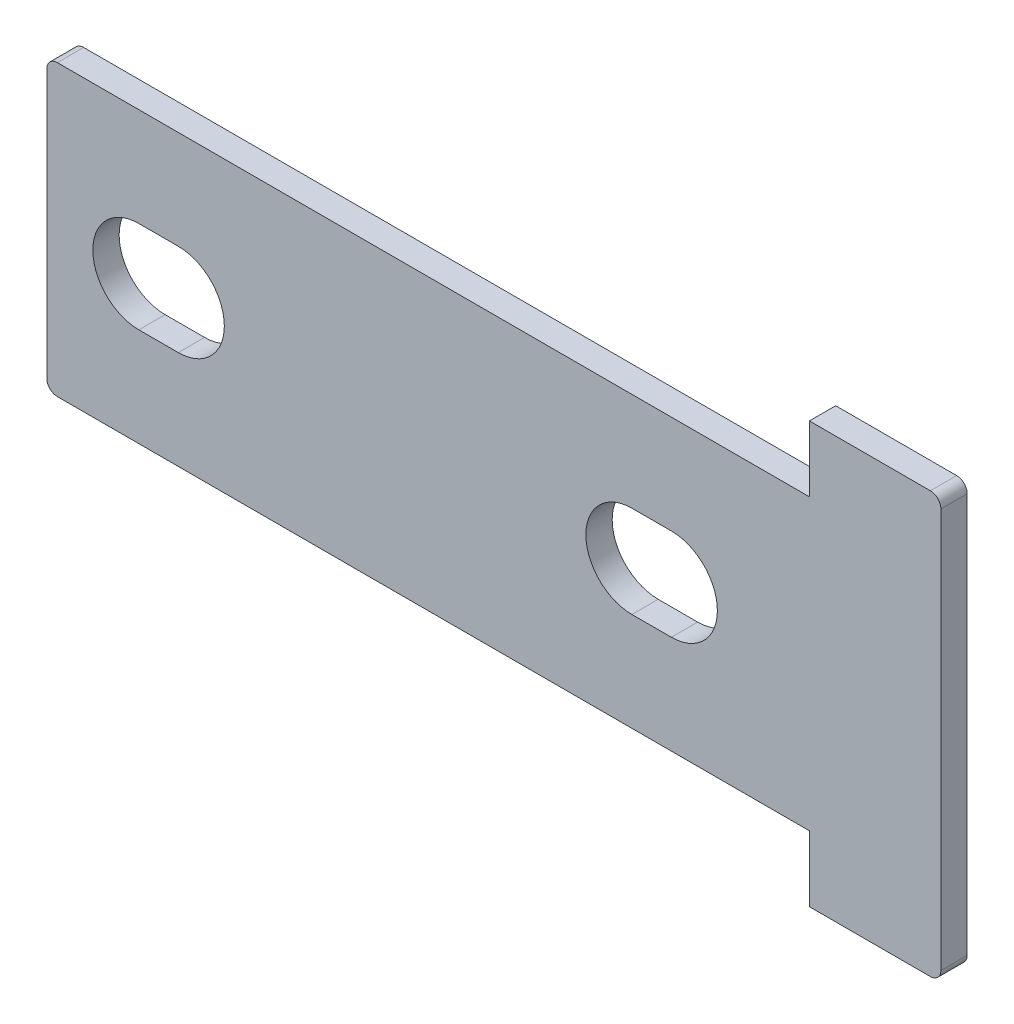
ISO-10303-21;
HEADER;
FILE_DESCRIPTION(('STEP AP214'),'2;1');
FILE_NAME('part.step','',(''),(''),'','','');
FILE_SCHEMA(('AUTOMOTIVE_DESIGN { 1 0 10303 214 1 1 1 1 }'));
ENDSEC;
DATA;
#1=APPLICATION_CONTEXT('core data for automotive mechanical design processes');
#2=APPLICATION_PROTOCOL_DEFINITION('international standard','automotive_design',2000,#1);
#3=PRODUCT_CONTEXT('',#1,'mechanical');
#4=PRODUCT('Part','Part','',(#3));
#5=PRODUCT_RELATED_PRODUCT_CATEGORY('part','',(#4));
#6=PRODUCT_DEFINITION_FORMATION('','',#4);
#7=PRODUCT_DEFINITION_CONTEXT('part definition',#1,'design');
#8=PRODUCT_DEFINITION('design','',#6,#7);
#9=PRODUCT_DEFINITION_SHAPE('','',#8);
#10=(LENGTH_UNIT() NAMED_UNIT(*) SI_UNIT(.MILLI.,.METRE.));
#11=(NAMED_UNIT(*) PLANE_ANGLE_UNIT() SI_UNIT($,.RADIAN.));
#12=(NAMED_UNIT(*) SI_UNIT($,.STERADIAN.) SOLID_ANGLE_UNIT());
#13=UNCERTAINTY_MEASURE_WITH_UNIT(LENGTH_MEASURE(1.E-05),#10,'distance_accuracy_value','');
#14=(GEOMETRIC_REPRESENTATION_CONTEXT(3) GLOBAL_UNCERTAINTY_ASSIGNED_CONTEXT((#13)) GLOBAL_UNIT_ASSIGNED_CONTEXT((#10,
#11,#12)) REPRESENTATION_CONTEXT('',''));
#15=CARTESIAN_POINT('',(0.,0.,0.));
#16=DIRECTION('',(0.,0.,1.));
#17=DIRECTION('',(1.,0.,0.));
#18=AXIS2_PLACEMENT_3D('',#15,#16,#17);
#19=CARTESIAN_POINT('',(-3.1,9.33265619299671,1.));
#20=DIRECTION('',(0.,0.,1.));
#21=DIRECTION('',(1.,0.,0.));
#22=AXIS2_PLACEMENT_3D('',#19,#20,#21);
#23=PLANE('',#22);
#24=CARTESIAN_POINT('',(-3.1,9.33265619299671,1.));
#25=DIRECTION('',(0.,0.,1.));
#26=DIRECTION('',(1.,0.,0.));
#27=AXIS2_PLACEMENT_3D('',#24,#25,#26);
#28=CIRCLE('',#27,0.399999999999999);
#29=CARTESIAN_POINT('',(-3.1,9.73265619299671,1.));
#30=VERTEX_POINT('',#29);
#31=CARTESIAN_POINT('',(-3.49999999999999,9.33265619299671,1.));
#32=VERTEX_POINT('',#31);
#33=EDGE_CURVE('E269',#30,#32,#28,.T.);
#34=ORIENTED_EDGE('',*,*,#33,.T.);
#35=DIRECTION('',(0.,-1.,0.));
#36=VECTOR('',#35,1.);
#37=CARTESIAN_POINT('',(-3.49999999999999,9.33265619299671,1.));
#38=LINE('',#37,#36);
#39=CARTESIAN_POINT('',(-3.49999999999999,-0.867343807003286,1.));
#40=VERTEX_POINT('',#39);
#41=EDGE_CURVE('E273',#32,#40,#38,.T.);
#42=ORIENTED_EDGE('',*,*,#41,.T.);
#43=CARTESIAN_POINT('',(-3.09999999999999,-0.867343807003286,1.));
#44=DIRECTION('',(0.,0.,1.));
#45=DIRECTION('',(1.,0.,0.));
#46=AXIS2_PLACEMENT_3D('',#43,#44,#45);
#47=CIRCLE('',#46,0.4);
#48=CARTESIAN_POINT('',(-3.09999999999999,-1.26734380700329,1.));
#49=VERTEX_POINT('',#48);
#50=EDGE_CURVE('E277',#40,#49,#47,.T.);
#51=ORIENTED_EDGE('',*,*,#50,.T.);
#52=DIRECTION('',(1.,0.,0.));
#53=VECTOR('',#52,1.);
#54=CARTESIAN_POINT('',(-3.09999999999999,-1.26734380700329,1.));
#55=LINE('',#54,#53);
#56=CARTESIAN_POINT('',(25.5,-1.26734380700328,1.));
#57=VERTEX_POINT('',#56);
#58=EDGE_CURVE('E280',#49,#57,#55,.T.);
#59=ORIENTED_EDGE('',*,*,#58,.T.);
#60=DIRECTION('',(0.,-1.,0.));
#61=VECTOR('',#60,1.);
#62=CARTESIAN_POINT('',(25.5,-1.26734380700328,1.));
#63=LINE('',#62,#61);
#64=CARTESIAN_POINT('',(25.5,-3.76734380700329,1.));
#65=VERTEX_POINT('',#64);
#66=EDGE_CURVE('E283',#57,#65,#63,.T.);
#67=ORIENTED_EDGE('',*,*,#66,.T.);
#68=DIRECTION('',(1.,0.,0.));
#69=VECTOR('',#68,1.);
#70=CARTESIAN_POINT('',(25.5,-3.76734380700329,1.));
#71=LINE('',#70,#69);
#72=CARTESIAN_POINT('',(30.1,-3.76734380700329,1.));
#73=VERTEX_POINT('',#72);
#74=EDGE_CURVE('E286',#65,#73,#71,.T.);
#75=ORIENTED_EDGE('',*,*,#74,.T.);
#76=CARTESIAN_POINT('',(30.1,-3.36734380700329,1.));
#77=DIRECTION('',(0.,0.,1.));
#78=DIRECTION('',(1.,0.,0.));
#79=AXIS2_PLACEMENT_3D('',#76,#77,#78);
#80=CIRCLE('',#79,0.399999999999998);
#81=CARTESIAN_POINT('',(30.5,-3.36734380700329,1.));
#82=VERTEX_POINT('',#81);
#83=EDGE_CURVE('E289',#73,#82,#80,.T.);
#84=ORIENTED_EDGE('',*,*,#83,.T.);
#85=DIRECTION('',(0.,1.,0.));
#86=VECTOR('',#85,1.);
#87=CARTESIAN_POINT('',(30.5,-3.36734380700329,1.));
#88=LINE('',#87,#86);
#89=CARTESIAN_POINT('',(30.5,11.8326561929967,1.));
#90=VERTEX_POINT('',#89);
#91=EDGE_CURVE('E292',#82,#90,#88,.T.);
#92=ORIENTED_EDGE('',*,*,#91,.T.);
#93=CARTESIAN_POINT('',(30.1,11.8326561929967,1.));
#94=DIRECTION('',(0.,0.,1.));
#95=DIRECTION('',(1.,0.,0.));
#96=AXIS2_PLACEMENT_3D('',#93,#94,#95);
#97=CIRCLE('',#96,0.399999999999998);
#98=CARTESIAN_POINT('',(30.1,12.2326561929967,1.));
#99=VERTEX_POINT('',#98);
#100=EDGE_CURVE('E295',#90,#99,#97,.T.);
#101=ORIENTED_EDGE('',*,*,#100,.T.);
#102=DIRECTION('',(-1.,0.,0.));
#103=VECTOR('',#102,1.);
#104=CARTESIAN_POINT('',(30.1,12.2326561929967,1.));
#105=LINE('',#104,#103);
#106=CARTESIAN_POINT('',(25.5,12.2326561929967,1.));
#107=VERTEX_POINT('',#106);
#108=EDGE_CURVE('E298',#99,#107,#105,.T.);
#109=ORIENTED_EDGE('',*,*,#108,.T.);
#110=DIRECTION('',(0.,-1.,0.));
#111=VECTOR('',#110,1.);
#112=CARTESIAN_POINT('',(25.5,12.2326561929967,1.));
#113=LINE('',#112,#111);
#114=CARTESIAN_POINT('',(25.5,9.73265619299672,1.));
#115=VERTEX_POINT('',#114);
#116=EDGE_CURVE('E301',#107,#115,#113,.T.);
#117=ORIENTED_EDGE('',*,*,#116,.T.);
#118=DIRECTION('',(-1.,0.,0.));
#119=VECTOR('',#118,1.);
#120=CARTESIAN_POINT('',(25.5,9.73265619299672,1.));
#121=LINE('',#120,#119);
#122=EDGE_CURVE('E304',#115,#30,#121,.T.);
#123=ORIENTED_EDGE('',*,*,#122,.T.);
#124=EDGE_LOOP('',(#34,#42,#51,#59,#67,#75,#84,#92,#101,#109,#117,#123));
#125=FACE_BOUND('',#124,.T.);
#126=DIRECTION('',(1.,0.,0.));
#127=VECTOR('',#126,1.);
#128=CARTESIAN_POINT('',(18.75,2.48265619299671,1.));
#129=LINE('',#128,#127);
#130=CARTESIAN_POINT('',(18.75,2.48265619299671,1.));
#131=VERTEX_POINT('',#130);
#132=CARTESIAN_POINT('',(20.25,2.48265619299672,1.));
#133=VERTEX_POINT('',#132);
#134=EDGE_CURVE('E229',#131,#133,#129,.T.);
#135=ORIENTED_EDGE('',*,*,#134,.F.);
#136=CARTESIAN_POINT('',(18.75,4.23265619299671,1.));
#137=DIRECTION('',(0.,0.,1.));
#138=DIRECTION('',(1.,0.,0.));
#139=AXIS2_PLACEMENT_3D('',#136,#137,#138);
#140=CIRCLE('',#139,1.75);
#141=CARTESIAN_POINT('',(18.75,5.98265619299671,1.));
#142=VERTEX_POINT('',#141);
#143=EDGE_CURVE('E226',#142,#131,#140,.T.);
#144=ORIENTED_EDGE('',*,*,#143,.F.);
#145=DIRECTION('',(-1.,0.,0.));
#146=VECTOR('',#145,1.);
#147=CARTESIAN_POINT('',(18.75,5.98265619299671,1.));
#148=LINE('',#147,#146);
#149=CARTESIAN_POINT('',(20.25,5.98265619299672,1.));
#150=VERTEX_POINT('',#149);
#151=EDGE_CURVE('E237',#150,#142,#148,.T.);
#152=ORIENTED_EDGE('',*,*,#151,.F.);
#153=CARTESIAN_POINT('',(20.25,4.23265619299672,1.));
#154=DIRECTION('',(0.,0.,1.));
#155=DIRECTION('',(1.,0.,0.));
#156=AXIS2_PLACEMENT_3D('',#153,#154,#155);
#157=CIRCLE('',#156,1.75);
#158=EDGE_CURVE('E233',#133,#150,#157,.T.);
#159=ORIENTED_EDGE('',*,*,#158,.F.);
#160=EDGE_LOOP('',(#135,#144,#152,#159));
#161=FACE_BOUND('',#160,.T.);
#162=DIRECTION('',(1.,0.,0.));
#163=VECTOR('',#162,1.);
#164=CARTESIAN_POINT('',(0.,2.48265619299671,1.));
#165=LINE('',#164,#163);
#166=CARTESIAN_POINT('',(0.,2.48265619299671,1.));
#167=VERTEX_POINT('',#166);
#168=CARTESIAN_POINT('',(1.50000000000001,2.48265619299671,1.));
#169=VERTEX_POINT('',#168);
#170=EDGE_CURVE('E186',#167,#169,#165,.T.);
#171=ORIENTED_EDGE('',*,*,#170,.F.);
#172=CARTESIAN_POINT('',(0.,4.23265619299671,1.));
#173=DIRECTION('',(0.,0.,1.));
#174=DIRECTION('',(1.,0.,0.));
#175=AXIS2_PLACEMENT_3D('',#172,#173,#174);
#176=CIRCLE('',#175,1.75);
#177=CARTESIAN_POINT('',(0.,5.98265619299671,1.));
#178=VERTEX_POINT('',#177);
#179=EDGE_CURVE('E177',#178,#167,#176,.T.);
#180=ORIENTED_EDGE('',*,*,#179,.F.);
#181=DIRECTION('',(-1.,0.,0.));
#182=VECTOR('',#181,1.);
#183=CARTESIAN_POINT('',(0.,5.98265619299671,1.));
#184=LINE('',#183,#182);
#185=CARTESIAN_POINT('',(1.50000000000001,5.98265619299671,1.));
#186=VERTEX_POINT('',#185);
#187=EDGE_CURVE('E204',#186,#178,#184,.T.);
#188=ORIENTED_EDGE('',*,*,#187,.F.);
#189=CARTESIAN_POINT('',(1.50000000000001,4.23265619299671,1.));
#190=DIRECTION('',(0.,0.,1.));
#191=DIRECTION('',(1.,0.,0.));
#192=AXIS2_PLACEMENT_3D('',#189,#190,#191);
#193=CIRCLE('',#192,1.75);
#194=EDGE_CURVE('E199',#169,#186,#193,.T.);
#195=ORIENTED_EDGE('',*,*,#194,.F.);
#196=EDGE_LOOP('',(#171,#180,#188,#195));
#197=FACE_BOUND('',#196,.T.);
#198=ADVANCED_FACE('F39',(#125,#161,#197),#23,.T.);
#199=CARTESIAN_POINT('',(-3.1,9.33265619299671,0.));
#200=DIRECTION('',(0.,0.,1.));
#201=DIRECTION('',(1.,0.,0.));
#202=AXIS2_PLACEMENT_3D('',#199,#200,#201);
#203=PLANE('',#202);
#204=CARTESIAN_POINT('',(18.75,4.23265619299671,0.));
#205=DIRECTION('',(0.,0.,1.));
#206=DIRECTION('',(1.,0.,0.));
#207=AXIS2_PLACEMENT_3D('',#204,#205,#206);
#208=CIRCLE('',#207,1.75);
#209=CARTESIAN_POINT('',(18.75,5.98265619299671,0.));
#210=VERTEX_POINT('',#209);
#211=CARTESIAN_POINT('',(18.75,2.48265619299671,0.));
#212=VERTEX_POINT('',#211);
#213=EDGE_CURVE('E195',#210,#212,#208,.T.);
#214=ORIENTED_EDGE('',*,*,#213,.T.);
#215=DIRECTION('',(1.,0.,0.));
#216=VECTOR('',#215,1.);
#217=CARTESIAN_POINT('',(18.75,2.48265619299671,0.));
#218=LINE('',#217,#216);
#219=CARTESIAN_POINT('',(20.25,2.48265619299672,0.));
#220=VERTEX_POINT('',#219);
#221=EDGE_CURVE('E244',#212,#220,#218,.T.);
#222=ORIENTED_EDGE('',*,*,#221,.T.);
#223=CARTESIAN_POINT('',(20.25,4.23265619299672,0.));
#224=DIRECTION('',(0.,0.,1.));
#225=DIRECTION('',(1.,0.,0.));
#226=AXIS2_PLACEMENT_3D('',#223,#224,#225);
#227=CIRCLE('',#226,1.75);
#228=CARTESIAN_POINT('',(20.25,5.98265619299672,0.));
#229=VERTEX_POINT('',#228);
#230=EDGE_CURVE('E248',#220,#229,#227,.T.);
#231=ORIENTED_EDGE('',*,*,#230,.T.);
#232=DIRECTION('',(-1.,0.,0.));
#233=VECTOR('',#232,1.);
#234=CARTESIAN_POINT('',(18.75,5.98265619299671,0.));
#235=LINE('',#234,#233);
#236=EDGE_CURVE('E230',#229,#210,#235,.T.);
#237=ORIENTED_EDGE('',*,*,#236,.T.);
#238=EDGE_LOOP('',(#214,#222,#231,#237));
#239=FACE_BOUND('',#238,.T.);
#240=CARTESIAN_POINT('',(-3.1,9.33265619299671,0.));
#241=DIRECTION('',(0.,0.,1.));
#242=DIRECTION('',(1.,0.,0.));
#243=AXIS2_PLACEMENT_3D('',#240,#241,#242);
#244=CIRCLE('',#243,0.399999999999999);
#245=CARTESIAN_POINT('',(-3.1,9.73265619299671,0.));
#246=VERTEX_POINT('',#245);
#247=CARTESIAN_POINT('',(-3.49999999999999,9.33265619299671,0.));
#248=VERTEX_POINT('',#247);
#249=EDGE_CURVE('E268',#246,#248,#244,.T.);
#250=ORIENTED_EDGE('',*,*,#249,.F.);
#251=DIRECTION('',(-1.,0.,0.));
#252=VECTOR('',#251,1.);
#253=CARTESIAN_POINT('',(25.5,9.73265619299672,0.));
#254=LINE('',#253,#252);
#255=CARTESIAN_POINT('',(25.5,9.73265619299672,0.));
#256=VERTEX_POINT('',#255);
#257=EDGE_CURVE('E274',#256,#246,#254,.T.);
#258=ORIENTED_EDGE('',*,*,#257,.F.);
#259=DIRECTION('',(0.,-1.,0.));
#260=VECTOR('',#259,1.);
#261=CARTESIAN_POINT('',(25.5,12.2326561929967,0.));
#262=LINE('',#261,#260);
#263=CARTESIAN_POINT('',(25.5,12.2326561929967,0.));
#264=VERTEX_POINT('',#263);
#265=EDGE_CURVE('E338',#264,#256,#262,.T.);
#266=ORIENTED_EDGE('',*,*,#265,.F.);
#267=DIRECTION('',(-1.,0.,0.));
#268=VECTOR('',#267,1.);
#269=CARTESIAN_POINT('',(30.1,12.2326561929967,0.));
#270=LINE('',#269,#268);
#271=CARTESIAN_POINT('',(30.1,12.2326561929967,0.));
#272=VERTEX_POINT('',#271);
#273=EDGE_CURVE('E335',#272,#264,#270,.T.);
#274=ORIENTED_EDGE('',*,*,#273,.F.);
#275=CARTESIAN_POINT('',(30.1,11.8326561929967,0.));
#276=DIRECTION('',(0.,0.,1.));
#277=DIRECTION('',(1.,0.,0.));
#278=AXIS2_PLACEMENT_3D('',#275,#276,#277);
#279=CIRCLE('',#278,0.399999999999998);
#280=CARTESIAN_POINT('',(30.5,11.8326561929967,0.));
#281=VERTEX_POINT('',#280);
#282=EDGE_CURVE('E332',#281,#272,#279,.T.);
#283=ORIENTED_EDGE('',*,*,#282,.F.);
#284=DIRECTION('',(0.,1.,0.));
#285=VECTOR('',#284,1.);
#286=CARTESIAN_POINT('',(30.5,-3.36734380700329,0.));
#287=LINE('',#286,#285);
#288=CARTESIAN_POINT('',(30.5,-3.36734380700329,0.));
#289=VERTEX_POINT('',#288);
#290=EDGE_CURVE('E329',#289,#281,#287,.T.);
#291=ORIENTED_EDGE('',*,*,#290,.F.);
#292=CARTESIAN_POINT('',(30.1,-3.36734380700329,0.));
#293=DIRECTION('',(0.,0.,1.));
#294=DIRECTION('',(1.,0.,0.));
#295=AXIS2_PLACEMENT_3D('',#292,#293,#294);
#296=CIRCLE('',#295,0.399999999999998);
#297=CARTESIAN_POINT('',(30.1,-3.76734380700329,0.));
#298=VERTEX_POINT('',#297);
#299=EDGE_CURVE('E326',#298,#289,#296,.T.);
#300=ORIENTED_EDGE('',*,*,#299,.F.);
#301=DIRECTION('',(1.,0.,0.));
#302=VECTOR('',#301,1.);
#303=CARTESIAN_POINT('',(25.5,-3.76734380700329,0.));
#304=LINE('',#303,#302);
#305=CARTESIAN_POINT('',(25.5,-3.76734380700329,0.));
#306=VERTEX_POINT('',#305);
#307=EDGE_CURVE('E323',#306,#298,#304,.T.);
#308=ORIENTED_EDGE('',*,*,#307,.F.);
#309=DIRECTION('',(0.,-1.,0.));
#310=VECTOR('',#309,1.);
#311=CARTESIAN_POINT('',(25.5,-1.26734380700328,0.));
#312=LINE('',#311,#310);
#313=CARTESIAN_POINT('',(25.5,-1.26734380700328,0.));
#314=VERTEX_POINT('',#313);
#315=EDGE_CURVE('E320',#314,#306,#312,.T.);
#316=ORIENTED_EDGE('',*,*,#315,.F.);
#317=DIRECTION('',(1.,0.,0.));
#318=VECTOR('',#317,1.);
#319=CARTESIAN_POINT('',(-3.09999999999999,-1.26734380700329,0.));
#320=LINE('',#319,#318);
#321=CARTESIAN_POINT('',(-3.09999999999999,-1.26734380700329,0.));
#322=VERTEX_POINT('',#321);
#323=EDGE_CURVE('E317',#322,#314,#320,.T.);
#324=ORIENTED_EDGE('',*,*,#323,.F.);
#325=CARTESIAN_POINT('',(-3.09999999999999,-0.867343807003286,0.));
#326=DIRECTION('',(0.,0.,1.));
#327=DIRECTION('',(1.,0.,0.));
#328=AXIS2_PLACEMENT_3D('',#325,#326,#327);
#329=CIRCLE('',#328,0.4);
#330=CARTESIAN_POINT('',(-3.49999999999999,-0.867343807003286,0.));
#331=VERTEX_POINT('',#330);
#332=EDGE_CURVE('E314',#331,#322,#329,.T.);
#333=ORIENTED_EDGE('',*,*,#332,.F.);
#334=DIRECTION('',(0.,-1.,0.));
#335=VECTOR('',#334,1.);
#336=CARTESIAN_POINT('',(-3.49999999999999,9.33265619299671,0.));
#337=LINE('',#336,#335);
#338=EDGE_CURVE('E311',#248,#331,#337,.T.);
#339=ORIENTED_EDGE('',*,*,#338,.F.);
#340=EDGE_LOOP('',(#250,#258,#266,#274,#283,#291,#300,#308,#316,#324,#333,#339));
#341=FACE_BOUND('',#340,.T.);
#342=CARTESIAN_POINT('',(0.,4.23265619299671,0.));
#343=DIRECTION('',(0.,0.,1.));
#344=DIRECTION('',(1.,0.,0.));
#345=AXIS2_PLACEMENT_3D('',#342,#343,#344);
#346=CIRCLE('',#345,1.75);
#347=CARTESIAN_POINT('',(0.,5.98265619299671,0.));
#348=VERTEX_POINT('',#347);
#349=CARTESIAN_POINT('',(0.,2.48265619299671,0.));
#350=VERTEX_POINT('',#349);
#351=EDGE_CURVE('E63',#348,#350,#346,.T.);
#352=ORIENTED_EDGE('',*,*,#351,.T.);
#353=DIRECTION('',(1.,0.,0.));
#354=VECTOR('',#353,1.);
#355=CARTESIAN_POINT('',(0.,2.48265619299671,0.));
#356=LINE('',#355,#354);
#357=CARTESIAN_POINT('',(1.50000000000001,2.48265619299671,0.));
#358=VERTEX_POINT('',#357);
#359=EDGE_CURVE('E193',#350,#358,#356,.T.);
#360=ORIENTED_EDGE('',*,*,#359,.T.);
#361=CARTESIAN_POINT('',(1.50000000000001,4.23265619299671,0.));
#362=DIRECTION('',(0.,0.,1.));
#363=DIRECTION('',(1.,0.,0.));
#364=AXIS2_PLACEMENT_3D('',#361,#362,#363);
#365=CIRCLE('',#364,1.75);
#366=CARTESIAN_POINT('',(1.50000000000001,5.98265619299671,0.));
#367=VERTEX_POINT('',#366);
#368=EDGE_CURVE('E213',#358,#367,#365,.T.);
#369=ORIENTED_EDGE('',*,*,#368,.T.);
#370=DIRECTION('',(-1.,0.,0.));
#371=VECTOR('',#370,1.);
#372=CARTESIAN_POINT('',(0.,5.98265619299671,0.));
#373=LINE('',#372,#371);
#374=EDGE_CURVE('E187',#367,#348,#373,.T.);
#375=ORIENTED_EDGE('',*,*,#374,.T.);
#376=EDGE_LOOP('',(#352,#360,#369,#375));
#377=FACE_BOUND('',#376,.T.);
#378=ADVANCED_FACE('F394',(#239,#341,#377),#203,.F.);
#379=CARTESIAN_POINT('',(-3.1,9.33265619299671,1.));
#380=DIRECTION('',(0.,0.,-1.));
#381=DIRECTION('',(-1.,0.,0.));
#382=AXIS2_PLACEMENT_3D('',#379,#380,#381);
#383=CYLINDRICAL_SURFACE('',#382,0.399999999999999);
#384=ORIENTED_EDGE('',*,*,#249,.T.);
#385=DIRECTION('',(0.,0.,-1.));
#386=VECTOR('',#385,1.);
#387=CARTESIAN_POINT('',(-3.49999999999999,9.33265619299671,1.));
#388=LINE('',#387,#386);
#389=EDGE_CURVE('E11',#32,#248,#388,.T.);
#390=ORIENTED_EDGE('',*,*,#389,.F.);
#391=ORIENTED_EDGE('',*,*,#33,.F.);
#392=DIRECTION('',(0.,0.,-1.));
#393=VECTOR('',#392,1.);
#394=CARTESIAN_POINT('',(-3.1,9.73265619299671,1.));
#395=LINE('',#394,#393);
#396=EDGE_CURVE('E307',#30,#246,#395,.T.);
#397=ORIENTED_EDGE('',*,*,#396,.T.);
#398=EDGE_LOOP('',(#384,#390,#391,#397));
#399=FACE_BOUND('',#398,.T.);
#400=ADVANCED_FACE('F41',(#399),#383,.T.);
#401=CARTESIAN_POINT('',(-3.49999999999999,9.33265619299671,1.));
#402=DIRECTION('',(1.,0.,0.));
#403=DIRECTION('',(0.,1.,0.));
#404=AXIS2_PLACEMENT_3D('',#401,#402,#403);
#405=PLANE('',#404);
#406=ORIENTED_EDGE('',*,*,#338,.T.);
#407=DIRECTION('',(0.,0.,-1.));
#408=VECTOR('',#407,1.);
#409=CARTESIAN_POINT('',(-3.49999999999999,-0.867343807003286,1.));
#410=LINE('',#409,#408);
#411=EDGE_CURVE('E48',#40,#331,#410,.T.);
#412=ORIENTED_EDGE('',*,*,#411,.F.);
#413=ORIENTED_EDGE('',*,*,#41,.F.);
#414=ORIENTED_EDGE('',*,*,#389,.T.);
#415=EDGE_LOOP('',(#406,#412,#413,#414));
#416=FACE_BOUND('',#415,.T.);
#417=ADVANCED_FACE('F412',(#416),#405,.F.);
#418=CARTESIAN_POINT('',(-3.09999999999999,-0.867343807003286,1.));
#419=DIRECTION('',(0.,0.,-1.));
#420=DIRECTION('',(-1.,0.,0.));
#421=AXIS2_PLACEMENT_3D('',#418,#419,#420);
#422=CYLINDRICAL_SURFACE('',#421,0.4);
#423=ORIENTED_EDGE('',*,*,#332,.T.);
#424=DIRECTION('',(0.,0.,-1.));
#425=VECTOR('',#424,1.);
#426=CARTESIAN_POINT('',(-3.09999999999999,-1.26734380700329,1.));
#427=LINE('',#426,#425);
#428=EDGE_CURVE('E378',#49,#322,#427,.T.);
#429=ORIENTED_EDGE('',*,*,#428,.F.);
#430=ORIENTED_EDGE('',*,*,#50,.F.);
#431=ORIENTED_EDGE('',*,*,#411,.T.);
#432=EDGE_LOOP('',(#423,#429,#430,#431));
#433=FACE_BOUND('',#432,.T.);
#434=ADVANCED_FACE('F388',(#433),#422,.T.);
#435=CARTESIAN_POINT('',(-3.09999999999999,-1.26734380700329,1.));
#436=DIRECTION('',(0.,1.,0.));
#437=DIRECTION('',(-1.,0.,0.));
#438=AXIS2_PLACEMENT_3D('',#435,#436,#437);
#439=PLANE('',#438);
#440=ORIENTED_EDGE('',*,*,#323,.T.);
#441=DIRECTION('',(0.,0.,-1.));
#442=VECTOR('',#441,1.);
#443=CARTESIAN_POINT('',(25.5,-1.26734380700328,1.));
#444=LINE('',#443,#442);
#445=EDGE_CURVE('E374',#57,#314,#444,.T.);
#446=ORIENTED_EDGE('',*,*,#445,.F.);
#447=ORIENTED_EDGE('',*,*,#58,.F.);
#448=ORIENTED_EDGE('',*,*,#428,.T.);
#449=EDGE_LOOP('',(#440,#446,#447,#448));
#450=FACE_BOUND('',#449,.T.);
#451=ADVANCED_FACE('F400',(#450),#439,.F.);
#452=CARTESIAN_POINT('',(25.5,-1.26734380700328,1.));
#453=DIRECTION('',(1.,0.,0.));
#454=DIRECTION('',(0.,0.,-1.));
#455=AXIS2_PLACEMENT_3D('',#452,#453,#454);
#456=PLANE('',#455);
#457=ORIENTED_EDGE('',*,*,#315,.T.);
#458=DIRECTION('',(0.,0.,-1.));
#459=VECTOR('',#458,1.);
#460=CARTESIAN_POINT('',(25.5,-3.76734380700329,1.));
#461=LINE('',#460,#459);
#462=EDGE_CURVE('E370',#65,#306,#461,.T.);
#463=ORIENTED_EDGE('',*,*,#462,.F.);
#464=ORIENTED_EDGE('',*,*,#66,.F.);
#465=ORIENTED_EDGE('',*,*,#445,.T.);
#466=EDGE_LOOP('',(#457,#463,#464,#465));
#467=FACE_BOUND('',#466,.T.);
#468=ADVANCED_FACE('F404',(#467),#456,.F.);
#469=CARTESIAN_POINT('',(25.5,-3.76734380700329,1.));
#470=DIRECTION('',(0.,1.,0.));
#471=DIRECTION('',(0.,0.,1.));
#472=AXIS2_PLACEMENT_3D('',#469,#470,#471);
#473=PLANE('',#472);
#474=ORIENTED_EDGE('',*,*,#307,.T.);
#475=DIRECTION('',(0.,0.,-1.));
#476=VECTOR('',#475,1.);
#477=CARTESIAN_POINT('',(30.1,-3.76734380700329,1.));
#478=LINE('',#477,#476);
#479=EDGE_CURVE('E366',#73,#298,#478,.T.);
#480=ORIENTED_EDGE('',*,*,#479,.F.);
#481=ORIENTED_EDGE('',*,*,#74,.F.);
#482=ORIENTED_EDGE('',*,*,#462,.T.);
#483=EDGE_LOOP('',(#474,#480,#481,#482));
#484=FACE_BOUND('',#483,.T.);
#485=ADVANCED_FACE('F445',(#484),#473,.F.);
#486=CARTESIAN_POINT('',(30.1,-3.36734380700329,1.));
#487=DIRECTION('',(0.,0.,-1.));
#488=DIRECTION('',(-1.,0.,0.));
#489=AXIS2_PLACEMENT_3D('',#486,#487,#488);
#490=CYLINDRICAL_SURFACE('',#489,0.399999999999998);
#491=ORIENTED_EDGE('',*,*,#299,.T.);
#492=DIRECTION('',(0.,0.,-1.));
#493=VECTOR('',#492,1.);
#494=CARTESIAN_POINT('',(30.5,-3.36734380700329,1.));
#495=LINE('',#494,#493);
#496=EDGE_CURVE('E362',#82,#289,#495,.T.);
#497=ORIENTED_EDGE('',*,*,#496,.F.);
#498=ORIENTED_EDGE('',*,*,#83,.F.);
#499=ORIENTED_EDGE('',*,*,#479,.T.);
#500=EDGE_LOOP('',(#491,#497,#498,#499));
#501=FACE_BOUND('',#500,.T.);
#502=ADVANCED_FACE('F443',(#501),#490,.T.);
#503=CARTESIAN_POINT('',(30.5,-3.36734380700329,1.));
#504=DIRECTION('',(-1.,0.,0.));
#505=DIRECTION('',(0.,0.,1.));
#506=AXIS2_PLACEMENT_3D('',#503,#504,#505);
#507=PLANE('',#506);
#508=ORIENTED_EDGE('',*,*,#290,.T.);
#509=DIRECTION('',(0.,0.,-1.));
#510=VECTOR('',#509,1.);
#511=CARTESIAN_POINT('',(30.5,11.8326561929967,1.));
#512=LINE('',#511,#510);
#513=EDGE_CURVE('E358',#90,#281,#512,.T.);
#514=ORIENTED_EDGE('',*,*,#513,.F.);
#515=ORIENTED_EDGE('',*,*,#91,.F.);
#516=ORIENTED_EDGE('',*,*,#496,.T.);
#517=EDGE_LOOP('',(#508,#514,#515,#516));
#518=FACE_BOUND('',#517,.T.);
#519=ADVANCED_FACE('F439',(#518),#507,.F.);
#520=CARTESIAN_POINT('',(30.1,11.8326561929967,1.));
#521=DIRECTION('',(0.,0.,-1.));
#522=DIRECTION('',(-1.,0.,0.));
#523=AXIS2_PLACEMENT_3D('',#520,#521,#522);
#524=CYLINDRICAL_SURFACE('',#523,0.399999999999998);
#525=ORIENTED_EDGE('',*,*,#282,.T.);
#526=DIRECTION('',(0.,0.,-1.));
#527=VECTOR('',#526,1.);
#528=CARTESIAN_POINT('',(30.1,12.2326561929967,1.));
#529=LINE('',#528,#527);
#530=EDGE_CURVE('E354',#99,#272,#529,.T.);
#531=ORIENTED_EDGE('',*,*,#530,.F.);
#532=ORIENTED_EDGE('',*,*,#100,.F.);
#533=ORIENTED_EDGE('',*,*,#513,.T.);
#534=EDGE_LOOP('',(#525,#531,#532,#533));
#535=FACE_BOUND('',#534,.T.);
#536=ADVANCED_FACE('F434',(#535),#524,.T.);
#537=CARTESIAN_POINT('',(30.1,12.2326561929967,1.));
#538=DIRECTION('',(0.,-1.,0.));
#539=DIRECTION('',(0.,0.,-1.));
#540=AXIS2_PLACEMENT_3D('',#537,#538,#539);
#541=PLANE('',#540);
#542=ORIENTED_EDGE('',*,*,#273,.T.);
#543=DIRECTION('',(0.,0.,-1.));
#544=VECTOR('',#543,1.);
#545=CARTESIAN_POINT('',(25.5,12.2326561929967,1.));
#546=LINE('',#545,#544);
#547=EDGE_CURVE('E350',#107,#264,#546,.T.);
#548=ORIENTED_EDGE('',*,*,#547,.F.);
#549=ORIENTED_EDGE('',*,*,#108,.F.);
#550=ORIENTED_EDGE('',*,*,#530,.T.);
#551=EDGE_LOOP('',(#542,#548,#549,#550));
#552=FACE_BOUND('',#551,.T.);
#553=ADVANCED_FACE('F428',(#552),#541,.F.);
#554=CARTESIAN_POINT('',(25.5,12.2326561929967,1.));
#555=DIRECTION('',(1.,0.,0.));
#556=DIRECTION('',(0.,0.,-1.));
#557=AXIS2_PLACEMENT_3D('',#554,#555,#556);
#558=PLANE('',#557);
#559=ORIENTED_EDGE('',*,*,#265,.T.);
#560=DIRECTION('',(0.,0.,-1.));
#561=VECTOR('',#560,1.);
#562=CARTESIAN_POINT('',(25.5,9.73265619299672,1.));
#563=LINE('',#562,#561);
#564=EDGE_CURVE('E346',#115,#256,#563,.T.);
#565=ORIENTED_EDGE('',*,*,#564,.F.);
#566=ORIENTED_EDGE('',*,*,#116,.F.);
#567=ORIENTED_EDGE('',*,*,#547,.T.);
#568=EDGE_LOOP('',(#559,#565,#566,#567));
#569=FACE_BOUND('',#568,.T.);
#570=ADVANCED_FACE('F424',(#569),#558,.F.);
#571=CARTESIAN_POINT('',(25.5,9.73265619299672,1.));
#572=DIRECTION('',(0.,-1.,0.));
#573=DIRECTION('',(1.,0.,0.));
#574=AXIS2_PLACEMENT_3D('',#571,#572,#573);
#575=PLANE('',#574);
#576=ORIENTED_EDGE('',*,*,#257,.T.);
#577=ORIENTED_EDGE('',*,*,#396,.F.);
#578=ORIENTED_EDGE('',*,*,#122,.F.);
#579=ORIENTED_EDGE('',*,*,#564,.T.);
#580=EDGE_LOOP('',(#576,#577,#578,#579));
#581=FACE_BOUND('',#580,.T.);
#582=ADVANCED_FACE('F419',(#581),#575,.F.);
#583=CARTESIAN_POINT('',(18.75,4.23265619299671,1.));
#584=DIRECTION('',(0.,0.,-1.));
#585=DIRECTION('',(-1.,0.,0.));
#586=AXIS2_PLACEMENT_3D('',#583,#584,#585);
#587=CYLINDRICAL_SURFACE('',#586,1.75);
#588=ORIENTED_EDGE('',*,*,#213,.F.);
#589=DIRECTION('',(0.,0.,-1.));
#590=VECTOR('',#589,1.);
#591=CARTESIAN_POINT('',(18.75,5.98265619299671,1.));
#592=LINE('',#591,#590);
#593=EDGE_CURVE('E240',#142,#210,#592,.T.);
#594=ORIENTED_EDGE('',*,*,#593,.F.);
#595=ORIENTED_EDGE('',*,*,#143,.T.);
#596=DIRECTION('',(0.,0.,-1.));
#597=VECTOR('',#596,1.);
#598=CARTESIAN_POINT('',(18.75,2.48265619299671,1.));
#599=LINE('',#598,#597);
#600=EDGE_CURVE('E264',#131,#212,#599,.T.);
#601=ORIENTED_EDGE('',*,*,#600,.T.);
#602=EDGE_LOOP('',(#588,#594,#595,#601));
#603=FACE_BOUND('',#602,.T.);
#604=ADVANCED_FACE('F462',(#603),#587,.F.);
#605=CARTESIAN_POINT('',(18.75,2.48265619299671,1.));
#606=DIRECTION('',(0.,1.,0.));
#607=DIRECTION('',(-1.,0.,0.));
#608=AXIS2_PLACEMENT_3D('',#605,#606,#607);
#609=PLANE('',#608);
#610=ORIENTED_EDGE('',*,*,#221,.F.);
#611=ORIENTED_EDGE('',*,*,#600,.F.);
#612=ORIENTED_EDGE('',*,*,#134,.T.);
#613=DIRECTION('',(0.,0.,-1.));
#614=VECTOR('',#613,1.);
#615=CARTESIAN_POINT('',(20.25,2.48265619299672,1.));
#616=LINE('',#615,#614);
#617=EDGE_CURVE('E261',#133,#220,#616,.T.);
#618=ORIENTED_EDGE('',*,*,#617,.T.);
#619=EDGE_LOOP('',(#610,#611,#612,#618));
#620=FACE_BOUND('',#619,.T.);
#621=ADVANCED_FACE('F500',(#620),#609,.T.);
#622=CARTESIAN_POINT('',(20.25,4.23265619299672,1.));
#623=DIRECTION('',(0.,0.,-1.));
#624=DIRECTION('',(-1.,0.,0.));
#625=AXIS2_PLACEMENT_3D('',#622,#623,#624);
#626=CYLINDRICAL_SURFACE('',#625,1.75);
#627=ORIENTED_EDGE('',*,*,#230,.F.);
#628=ORIENTED_EDGE('',*,*,#617,.F.);
#629=ORIENTED_EDGE('',*,*,#158,.T.);
#630=DIRECTION('',(0.,0.,-1.));
#631=VECTOR('',#630,1.);
#632=CARTESIAN_POINT('',(20.25,5.98265619299672,1.));
#633=LINE('',#632,#631);
#634=EDGE_CURVE('E258',#150,#229,#633,.T.);
#635=ORIENTED_EDGE('',*,*,#634,.T.);
#636=EDGE_LOOP('',(#627,#628,#629,#635));
#637=FACE_BOUND('',#636,.T.);
#638=ADVANCED_FACE('F507',(#637),#626,.F.);
#639=CARTESIAN_POINT('',(18.75,5.98265619299671,1.));
#640=DIRECTION('',(0.,-1.,0.));
#641=DIRECTION('',(1.,0.,0.));
#642=AXIS2_PLACEMENT_3D('',#639,#640,#641);
#643=PLANE('',#642);
#644=ORIENTED_EDGE('',*,*,#236,.F.);
#645=ORIENTED_EDGE('',*,*,#634,.F.);
#646=ORIENTED_EDGE('',*,*,#151,.T.);
#647=ORIENTED_EDGE('',*,*,#593,.T.);
#648=EDGE_LOOP('',(#644,#645,#646,#647));
#649=FACE_BOUND('',#648,.T.);
#650=ADVANCED_FACE('F514',(#649),#643,.T.);
#651=CARTESIAN_POINT('',(0.,4.23265619299671,1.));
#652=DIRECTION('',(0.,0.,-1.));
#653=DIRECTION('',(-1.,0.,0.));
#654=AXIS2_PLACEMENT_3D('',#651,#652,#653);
#655=CYLINDRICAL_SURFACE('',#654,1.75);
#656=ORIENTED_EDGE('',*,*,#351,.F.);
#657=DIRECTION('',(0.,0.,-1.));
#658=VECTOR('',#657,1.);
#659=CARTESIAN_POINT('',(0.,5.98265619299671,1.));
#660=LINE('',#659,#658);
#661=EDGE_CURVE('E181',#178,#348,#660,.T.);
#662=ORIENTED_EDGE('',*,*,#661,.F.);
#663=ORIENTED_EDGE('',*,*,#179,.T.);
#664=DIRECTION('',(0.,0.,-1.));
#665=VECTOR('',#664,1.);
#666=CARTESIAN_POINT('',(0.,2.48265619299671,1.));
#667=LINE('',#666,#665);
#668=EDGE_CURVE('E180',#167,#350,#667,.T.);
#669=ORIENTED_EDGE('',*,*,#668,.T.);
#670=EDGE_LOOP('',(#656,#662,#663,#669));
#671=FACE_BOUND('',#670,.T.);
#672=ADVANCED_FACE('F179',(#671),#655,.F.);
#673=CARTESIAN_POINT('',(0.,2.48265619299671,1.));
#674=DIRECTION('',(0.,1.,0.));
#675=DIRECTION('',(0.,0.,1.));
#676=AXIS2_PLACEMENT_3D('',#673,#674,#675);
#677=PLANE('',#676);
#678=ORIENTED_EDGE('',*,*,#359,.F.);
#679=ORIENTED_EDGE('',*,*,#668,.F.);
#680=ORIENTED_EDGE('',*,*,#170,.T.);
#681=DIRECTION('',(0.,0.,-1.));
#682=VECTOR('',#681,1.);
#683=CARTESIAN_POINT('',(1.50000000000001,2.48265619299671,1.));
#684=LINE('',#683,#682);
#685=EDGE_CURVE('E196',#169,#358,#684,.T.);
#686=ORIENTED_EDGE('',*,*,#685,.T.);
#687=EDGE_LOOP('',(#678,#679,#680,#686));
#688=FACE_BOUND('',#687,.T.);
#689=ADVANCED_FACE('F190',(#688),#677,.T.);
#690=CARTESIAN_POINT('',(1.50000000000001,4.23265619299671,1.));
#691=DIRECTION('',(0.,0.,-1.));
#692=DIRECTION('',(-1.,0.,0.));
#693=AXIS2_PLACEMENT_3D('',#690,#691,#692);
#694=CYLINDRICAL_SURFACE('',#693,1.75);
#695=ORIENTED_EDGE('',*,*,#368,.F.);
#696=ORIENTED_EDGE('',*,*,#685,.F.);
#697=ORIENTED_EDGE('',*,*,#194,.T.);
#698=DIRECTION('',(0.,0.,-1.));
#699=VECTOR('',#698,1.);
#700=CARTESIAN_POINT('',(1.50000000000001,5.98265619299671,1.));
#701=LINE('',#700,#699);
#702=EDGE_CURVE('E55',#186,#367,#701,.T.);
#703=ORIENTED_EDGE('',*,*,#702,.T.);
#704=EDGE_LOOP('',(#695,#696,#697,#703));
#705=FACE_BOUND('',#704,.T.);
#706=ADVANCED_FACE('F535',(#705),#694,.F.);
#707=CARTESIAN_POINT('',(0.,5.98265619299671,1.));
#708=DIRECTION('',(0.,-1.,0.));
#709=DIRECTION('',(0.,0.,-1.));
#710=AXIS2_PLACEMENT_3D('',#707,#708,#709);
#711=PLANE('',#710);
#712=ORIENTED_EDGE('',*,*,#374,.F.);
#713=ORIENTED_EDGE('',*,*,#702,.F.);
#714=ORIENTED_EDGE('',*,*,#187,.T.);
#715=ORIENTED_EDGE('',*,*,#661,.T.);
#716=EDGE_LOOP('',(#712,#713,#714,#715));
#717=FACE_BOUND('',#716,.T.);
#718=ADVANCED_FACE('F542',(#717),#711,.T.);
#719=CLOSED_SHELL('',(#198,#378,#400,#417,#434,#451,#468,#485,#502,#519,#536,#553,#570,#582,
#604,#621,#638,#650,#672,#689,#706,#718));
#720=MANIFOLD_SOLID_BREP('B2',#719);
#721=ADVANCED_BREP_SHAPE_REPRESENTATION('',(#18,#720),#14);
#722=SHAPE_DEFINITION_REPRESENTATION(#9,#721);
ENDSEC;
END-ISO-10303-21;
